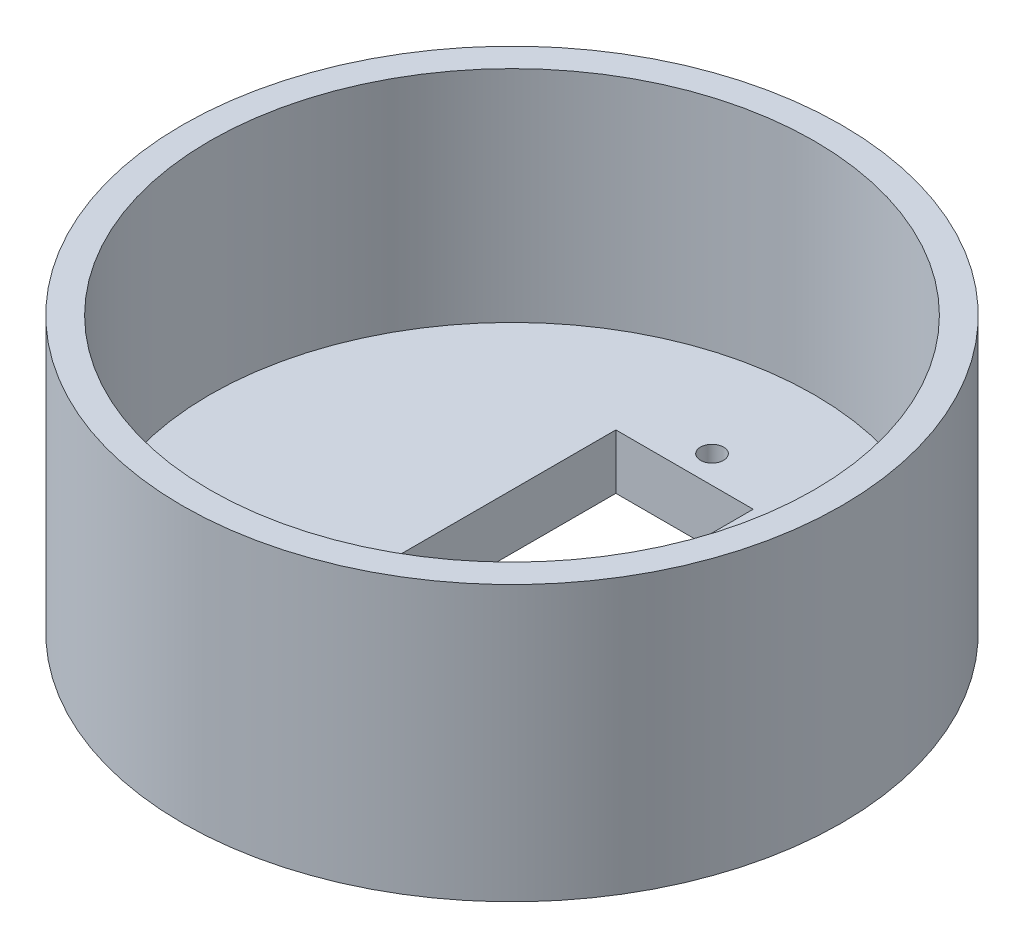
ISO-10303-21;
HEADER;
FILE_DESCRIPTION(('STEP AP214'),'2;1');
FILE_NAME('part.step','',(''),(''),'','','');
FILE_SCHEMA(('AUTOMOTIVE_DESIGN { 1 0 10303 214 1 1 1 1 }'));
ENDSEC;
DATA;
#1=APPLICATION_CONTEXT('core data for automotive mechanical design processes');
#2=APPLICATION_PROTOCOL_DEFINITION('international standard','automotive_design',2000,#1);
#3=PRODUCT_CONTEXT('',#1,'mechanical');
#4=PRODUCT('Part','Part','',(#3));
#5=PRODUCT_RELATED_PRODUCT_CATEGORY('part','',(#4));
#6=PRODUCT_DEFINITION_FORMATION('','',#4);
#7=PRODUCT_DEFINITION_CONTEXT('part definition',#1,'design');
#8=PRODUCT_DEFINITION('design','',#6,#7);
#9=PRODUCT_DEFINITION_SHAPE('','',#8);
#10=(LENGTH_UNIT() NAMED_UNIT(*) SI_UNIT(.MILLI.,.METRE.));
#11=(NAMED_UNIT(*) PLANE_ANGLE_UNIT() SI_UNIT($,.RADIAN.));
#12=(NAMED_UNIT(*) SI_UNIT($,.STERADIAN.) SOLID_ANGLE_UNIT());
#13=UNCERTAINTY_MEASURE_WITH_UNIT(LENGTH_MEASURE(1.E-05),#10,'distance_accuracy_value','');
#14=(GEOMETRIC_REPRESENTATION_CONTEXT(3) GLOBAL_UNCERTAINTY_ASSIGNED_CONTEXT((#13)) GLOBAL_UNIT_ASSIGNED_CONTEXT((#10,
#11,#12)) REPRESENTATION_CONTEXT('',''));
#15=CARTESIAN_POINT('',(0.,0.,0.));
#16=DIRECTION('',(0.,0.,1.));
#17=DIRECTION('',(1.,0.,0.));
#18=AXIS2_PLACEMENT_3D('',#15,#16,#17);
#19=CARTESIAN_POINT('',(0.,5.,0.));
#20=DIRECTION('',(0.,1.,0.));
#21=DIRECTION('',(0.,0.,1.));
#22=AXIS2_PLACEMENT_3D('',#19,#20,#21);
#23=PLANE('',#22);
#24=CARTESIAN_POINT('',(0.,5.,-18.2));
#25=DIRECTION('',(0.,1.,0.));
#26=DIRECTION('',(0.,0.,1.));
#27=AXIS2_PLACEMENT_3D('',#24,#25,#26);
#28=CIRCLE('',#27,1.05);
#29=CARTESIAN_POINT('',(0.,5.,-17.15));
#30=VERTEX_POINT('',#29);
#31=EDGE_CURVE('E211',#30,#30,#28,.T.);
#32=ORIENTED_EDGE('',*,*,#31,.F.);
#33=EDGE_LOOP('',(#32));
#34=FACE_BOUND('',#33,.T.);
#35=CARTESIAN_POINT('',(0.,5.,10.));
#36=DIRECTION('',(0.,1.,0.));
#37=DIRECTION('',(0.,0.,1.));
#38=AXIS2_PLACEMENT_3D('',#35,#36,#37);
#39=CIRCLE('',#38,1.05);
#40=CARTESIAN_POINT('',(0.,5.,11.05));
#41=VERTEX_POINT('',#40);
#42=EDGE_CURVE('E222',#41,#41,#39,.T.);
#43=ORIENTED_EDGE('',*,*,#42,.F.);
#44=EDGE_LOOP('',(#43));
#45=FACE_BOUND('',#44,.T.);
#46=DIRECTION('',(1.,0.,0.));
#47=VECTOR('',#46,1.);
#48=CARTESIAN_POINT('',(-6.25,5.,7.5));
#49=LINE('',#48,#47);
#50=CARTESIAN_POINT('',(-6.25,5.,7.5));
#51=VERTEX_POINT('',#50);
#52=CARTESIAN_POINT('',(6.25000000000001,5.,7.5));
#53=VERTEX_POINT('',#52);
#54=EDGE_CURVE('E84',#51,#53,#49,.T.);
#55=ORIENTED_EDGE('',*,*,#54,.F.);
#56=DIRECTION('',(0.,0.,1.));
#57=VECTOR('',#56,1.);
#58=CARTESIAN_POINT('',(-6.25,5.,-15.7));
#59=LINE('',#58,#57);
#60=CARTESIAN_POINT('',(-6.25,5.,-15.7));
#61=VERTEX_POINT('',#60);
#62=EDGE_CURVE('E76',#61,#51,#59,.T.);
#63=ORIENTED_EDGE('',*,*,#62,.F.);
#64=DIRECTION('',(-1.,0.,0.));
#65=VECTOR('',#64,1.);
#66=CARTESIAN_POINT('',(-6.25,5.,-15.7));
#67=LINE('',#66,#65);
#68=CARTESIAN_POINT('',(6.25,5.,-15.7));
#69=VERTEX_POINT('',#68);
#70=EDGE_CURVE('E98',#69,#61,#67,.T.);
#71=ORIENTED_EDGE('',*,*,#70,.F.);
#72=DIRECTION('',(0.,0.,-1.));
#73=VECTOR('',#72,1.);
#74=CARTESIAN_POINT('',(6.25,5.,-15.7));
#75=LINE('',#74,#73);
#76=EDGE_CURVE('E96',#53,#69,#75,.T.);
#77=ORIENTED_EDGE('',*,*,#76,.F.);
#78=EDGE_LOOP('',(#55,#63,#71,#77));
#79=FACE_BOUND('',#78,.T.);
#80=CARTESIAN_POINT('',(0.,5.,0.));
#81=DIRECTION('',(0.,1.,0.));
#82=DIRECTION('',(0.,0.,1.));
#83=AXIS2_PLACEMENT_3D('',#80,#81,#82);
#84=CIRCLE('',#83,27.5);
#85=CARTESIAN_POINT('',(0.,5.,27.5));
#86=VERTEX_POINT('',#85);
#87=EDGE_CURVE('E11',#86,#86,#84,.F.);
#88=ORIENTED_EDGE('',*,*,#87,.F.);
#89=EDGE_LOOP('',(#88));
#90=FACE_BOUND('',#89,.T.);
#91=ADVANCED_FACE('F35',(#34,#45,#79,#90),#23,.T.);
#92=CARTESIAN_POINT('',(0.,0.,0.));
#93=DIRECTION('',(0.,1.,0.));
#94=DIRECTION('',(0.,0.,1.));
#95=AXIS2_PLACEMENT_3D('',#92,#93,#94);
#96=PLANE('',#95);
#97=CARTESIAN_POINT('',(0.,0.,-18.2));
#98=DIRECTION('',(0.,1.,0.));
#99=DIRECTION('',(0.,0.,1.));
#100=AXIS2_PLACEMENT_3D('',#97,#98,#99);
#101=CIRCLE('',#100,1.05);
#102=CARTESIAN_POINT('',(0.,0.,-17.15));
#103=VERTEX_POINT('',#102);
#104=EDGE_CURVE('E214',#103,#103,#101,.F.);
#105=ORIENTED_EDGE('',*,*,#104,.F.);
#106=EDGE_LOOP('',(#105));
#107=FACE_BOUND('',#106,.T.);
#108=CARTESIAN_POINT('',(0.,0.,10.));
#109=DIRECTION('',(0.,1.,0.));
#110=DIRECTION('',(0.,0.,1.));
#111=AXIS2_PLACEMENT_3D('',#108,#109,#110);
#112=CIRCLE('',#111,1.05);
#113=CARTESIAN_POINT('',(0.,0.,11.05));
#114=VERTEX_POINT('',#113);
#115=EDGE_CURVE('E219',#114,#114,#112,.F.);
#116=ORIENTED_EDGE('',*,*,#115,.F.);
#117=EDGE_LOOP('',(#116));
#118=FACE_BOUND('',#117,.T.);
#119=CARTESIAN_POINT('',(0.,0.,0.));
#120=DIRECTION('',(0.,1.,0.));
#121=DIRECTION('',(0.,0.,1.));
#122=AXIS2_PLACEMENT_3D('',#119,#120,#121);
#123=CIRCLE('',#122,30.);
#124=CARTESIAN_POINT('',(0.,0.,30.));
#125=VERTEX_POINT('',#124);
#126=EDGE_CURVE('E43',#125,#125,#123,.T.);
#127=ORIENTED_EDGE('',*,*,#126,.F.);
#128=EDGE_LOOP('',(#127));
#129=FACE_BOUND('',#128,.T.);
#130=DIRECTION('',(0.,0.,1.));
#131=VECTOR('',#130,1.);
#132=CARTESIAN_POINT('',(-6.25,0.,-15.7));
#133=LINE('',#132,#131);
#134=CARTESIAN_POINT('',(-6.25,0.,-15.7));
#135=VERTEX_POINT('',#134);
#136=CARTESIAN_POINT('',(-6.25,0.,7.5));
#137=VERTEX_POINT('',#136);
#138=EDGE_CURVE('E58',#135,#137,#133,.T.);
#139=ORIENTED_EDGE('',*,*,#138,.T.);
#140=DIRECTION('',(1.,0.,0.));
#141=VECTOR('',#140,1.);
#142=CARTESIAN_POINT('',(-6.25,0.,7.5));
#143=LINE('',#142,#141);
#144=CARTESIAN_POINT('',(6.25000000000001,0.,7.5));
#145=VERTEX_POINT('',#144);
#146=EDGE_CURVE('E91',#137,#145,#143,.T.);
#147=ORIENTED_EDGE('',*,*,#146,.T.);
#148=DIRECTION('',(0.,0.,-1.));
#149=VECTOR('',#148,1.);
#150=CARTESIAN_POINT('',(6.25,0.,-15.7));
#151=LINE('',#150,#149);
#152=CARTESIAN_POINT('',(6.25,0.,-15.7));
#153=VERTEX_POINT('',#152);
#154=EDGE_CURVE('E106',#145,#153,#151,.T.);
#155=ORIENTED_EDGE('',*,*,#154,.T.);
#156=DIRECTION('',(-1.,0.,0.));
#157=VECTOR('',#156,1.);
#158=CARTESIAN_POINT('',(-6.25,0.,-15.7));
#159=LINE('',#158,#157);
#160=EDGE_CURVE('E85',#153,#135,#159,.T.);
#161=ORIENTED_EDGE('',*,*,#160,.T.);
#162=EDGE_LOOP('',(#139,#147,#155,#161));
#163=FACE_BOUND('',#162,.T.);
#164=ADVANCED_FACE('F118',(#107,#118,#129,#163),#96,.F.);
#165=CARTESIAN_POINT('',(0.,5.,0.));
#166=DIRECTION('',(0.,-1.,0.));
#167=DIRECTION('',(0.,0.,-1.));
#168=AXIS2_PLACEMENT_3D('',#165,#166,#167);
#169=CYLINDRICAL_SURFACE('',#168,30.);
#170=ORIENTED_EDGE('',*,*,#126,.T.);
#171=EDGE_LOOP('',(#170));
#172=FACE_BOUND('',#171,.T.);
#173=CARTESIAN_POINT('',(0.,25.,0.));
#174=DIRECTION('',(0.,1.,0.));
#175=DIRECTION('',(0.,0.,1.));
#176=AXIS2_PLACEMENT_3D('',#173,#174,#175);
#177=CIRCLE('',#176,30.);
#178=CARTESIAN_POINT('',(0.,25.,30.));
#179=VERTEX_POINT('',#178);
#180=EDGE_CURVE('E104',#179,#179,#177,.T.);
#181=ORIENTED_EDGE('',*,*,#180,.F.);
#182=EDGE_LOOP('',(#181));
#183=FACE_BOUND('',#182,.T.);
#184=ADVANCED_FACE('F37',(#172,#183),#169,.T.);
#185=CARTESIAN_POINT('',(-6.25,5.,-15.7));
#186=DIRECTION('',(1.,0.,0.));
#187=DIRECTION('',(0.,0.,-1.));
#188=AXIS2_PLACEMENT_3D('',#185,#186,#187);
#189=PLANE('',#188);
#190=ORIENTED_EDGE('',*,*,#138,.F.);
#191=DIRECTION('',(0.,-1.,0.));
#192=VECTOR('',#191,1.);
#193=CARTESIAN_POINT('',(-6.25,5.,-15.7));
#194=LINE('',#193,#192);
#195=EDGE_CURVE('E80',#61,#135,#194,.T.);
#196=ORIENTED_EDGE('',*,*,#195,.F.);
#197=ORIENTED_EDGE('',*,*,#62,.T.);
#198=DIRECTION('',(0.,-1.,0.));
#199=VECTOR('',#198,1.);
#200=CARTESIAN_POINT('',(-6.25,5.,7.5));
#201=LINE('',#200,#199);
#202=EDGE_CURVE('E79',#51,#137,#201,.T.);
#203=ORIENTED_EDGE('',*,*,#202,.T.);
#204=EDGE_LOOP('',(#190,#196,#197,#203));
#205=FACE_BOUND('',#204,.T.);
#206=ADVANCED_FACE('F78',(#205),#189,.T.);
#207=CARTESIAN_POINT('',(-6.25,5.,7.5));
#208=DIRECTION('',(0.,0.,-1.));
#209=DIRECTION('',(-1.,0.,0.));
#210=AXIS2_PLACEMENT_3D('',#207,#208,#209);
#211=PLANE('',#210);
#212=ORIENTED_EDGE('',*,*,#146,.F.);
#213=ORIENTED_EDGE('',*,*,#202,.F.);
#214=ORIENTED_EDGE('',*,*,#54,.T.);
#215=DIRECTION('',(0.,-1.,0.));
#216=VECTOR('',#215,1.);
#217=CARTESIAN_POINT('',(6.25000000000001,5.,7.5));
#218=LINE('',#217,#216);
#219=EDGE_CURVE('E92',#53,#145,#218,.T.);
#220=ORIENTED_EDGE('',*,*,#219,.T.);
#221=EDGE_LOOP('',(#212,#213,#214,#220));
#222=FACE_BOUND('',#221,.T.);
#223=ADVANCED_FACE('F88',(#222),#211,.T.);
#224=CARTESIAN_POINT('',(6.25,5.,-15.7));
#225=DIRECTION('',(-1.,0.,0.));
#226=DIRECTION('',(0.,0.,1.));
#227=AXIS2_PLACEMENT_3D('',#224,#225,#226);
#228=PLANE('',#227);
#229=ORIENTED_EDGE('',*,*,#154,.F.);
#230=ORIENTED_EDGE('',*,*,#219,.F.);
#231=ORIENTED_EDGE('',*,*,#76,.T.);
#232=DIRECTION('',(0.,-1.,0.));
#233=VECTOR('',#232,1.);
#234=CARTESIAN_POINT('',(6.25,5.,-15.7));
#235=LINE('',#234,#233);
#236=EDGE_CURVE('E50',#69,#153,#235,.T.);
#237=ORIENTED_EDGE('',*,*,#236,.T.);
#238=EDGE_LOOP('',(#229,#230,#231,#237));
#239=FACE_BOUND('',#238,.T.);
#240=ADVANCED_FACE('F126',(#239),#228,.T.);
#241=CARTESIAN_POINT('',(-6.25,5.,-15.7));
#242=DIRECTION('',(0.,0.,1.));
#243=DIRECTION('',(1.,0.,0.));
#244=AXIS2_PLACEMENT_3D('',#241,#242,#243);
#245=PLANE('',#244);
#246=ORIENTED_EDGE('',*,*,#160,.F.);
#247=ORIENTED_EDGE('',*,*,#236,.F.);
#248=ORIENTED_EDGE('',*,*,#70,.T.);
#249=ORIENTED_EDGE('',*,*,#195,.T.);
#250=EDGE_LOOP('',(#246,#247,#248,#249));
#251=FACE_BOUND('',#250,.T.);
#252=ADVANCED_FACE('F123',(#251),#245,.T.);
#253=CARTESIAN_POINT('',(0.,25.,0.));
#254=DIRECTION('',(0.,1.,0.));
#255=DIRECTION('',(0.,0.,1.));
#256=AXIS2_PLACEMENT_3D('',#253,#254,#255);
#257=PLANE('',#256);
#258=ORIENTED_EDGE('',*,*,#180,.T.);
#259=EDGE_LOOP('',(#258));
#260=FACE_BOUND('',#259,.T.);
#261=CARTESIAN_POINT('',(0.,25.,0.));
#262=DIRECTION('',(0.,1.,0.));
#263=DIRECTION('',(0.,0.,1.));
#264=AXIS2_PLACEMENT_3D('',#261,#262,#263);
#265=CIRCLE('',#264,27.5);
#266=CARTESIAN_POINT('',(0.,25.,27.5));
#267=VERTEX_POINT('',#266);
#268=EDGE_CURVE('E215',#267,#267,#265,.T.);
#269=ORIENTED_EDGE('',*,*,#268,.F.);
#270=EDGE_LOOP('',(#269));
#271=FACE_BOUND('',#270,.T.);
#272=ADVANCED_FACE('F125',(#260,#271),#257,.T.);
#273=CARTESIAN_POINT('',(0.,25.,0.));
#274=DIRECTION('',(0.,-1.,0.));
#275=DIRECTION('',(0.,0.,-1.));
#276=AXIS2_PLACEMENT_3D('',#273,#274,#275);
#277=CYLINDRICAL_SURFACE('',#276,27.5);
#278=ORIENTED_EDGE('',*,*,#268,.T.);
#279=EDGE_LOOP('',(#278));
#280=FACE_BOUND('',#279,.T.);
#281=ORIENTED_EDGE('',*,*,#87,.T.);
#282=EDGE_LOOP('',(#281));
#283=FACE_BOUND('',#282,.T.);
#284=ADVANCED_FACE('F133',(#280,#283),#277,.F.);
#285=CARTESIAN_POINT('',(0.,-0.00100000000000013,10.));
#286=DIRECTION('',(0.,1.,0.));
#287=DIRECTION('',(0.,0.,1.));
#288=AXIS2_PLACEMENT_3D('',#285,#286,#287);
#289=CYLINDRICAL_SURFACE('',#288,1.05);
#290=ORIENTED_EDGE('',*,*,#42,.T.);
#291=EDGE_LOOP('',(#290));
#292=FACE_BOUND('',#291,.T.);
#293=ORIENTED_EDGE('',*,*,#115,.T.);
#294=EDGE_LOOP('',(#293));
#295=FACE_BOUND('',#294,.T.);
#296=ADVANCED_FACE('F184',(#292,#295),#289,.F.);
#297=CARTESIAN_POINT('',(0.,-0.00100000000000013,-18.2));
#298=DIRECTION('',(0.,1.,0.));
#299=DIRECTION('',(0.,0.,1.));
#300=AXIS2_PLACEMENT_3D('',#297,#298,#299);
#301=CYLINDRICAL_SURFACE('',#300,1.05);
#302=ORIENTED_EDGE('',*,*,#31,.T.);
#303=EDGE_LOOP('',(#302));
#304=FACE_BOUND('',#303,.T.);
#305=ORIENTED_EDGE('',*,*,#104,.T.);
#306=EDGE_LOOP('',(#305));
#307=FACE_BOUND('',#306,.T.);
#308=ADVANCED_FACE('F195',(#304,#307),#301,.F.);
#309=CLOSED_SHELL('',(#91,#164,#184,#206,#223,#240,#252,#272,#284,#296,#308));
#310=MANIFOLD_SOLID_BREP('B2',#309);
#311=ADVANCED_BREP_SHAPE_REPRESENTATION('',(#18,#310),#14);
#312=SHAPE_DEFINITION_REPRESENTATION(#9,#311);
ENDSEC;
END-ISO-10303-21;
